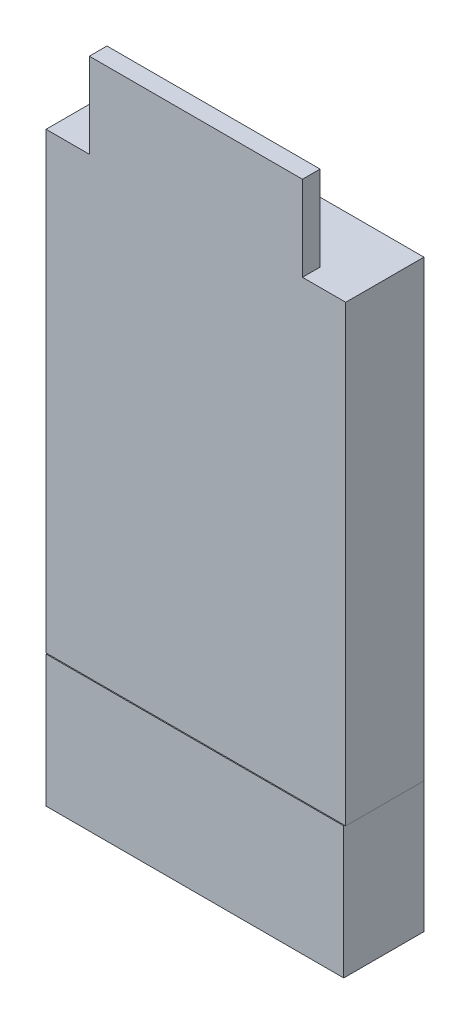
ISO-10303-21;
HEADER;
FILE_DESCRIPTION(('STEP AP214'),'2;1');
FILE_NAME('part.step','',(''),(''),'','','');
FILE_SCHEMA(('AUTOMOTIVE_DESIGN { 1 0 10303 214 1 1 1 1 }'));
ENDSEC;
DATA;
#1=APPLICATION_CONTEXT('core data for automotive mechanical design processes');
#2=APPLICATION_PROTOCOL_DEFINITION('international standard','automotive_design',2000,#1);
#3=PRODUCT_CONTEXT('',#1,'mechanical');
#4=PRODUCT('Part','Part','',(#3));
#5=PRODUCT_RELATED_PRODUCT_CATEGORY('part','',(#4));
#6=PRODUCT_DEFINITION_FORMATION('','',#4);
#7=PRODUCT_DEFINITION_CONTEXT('part definition',#1,'design');
#8=PRODUCT_DEFINITION('design','',#6,#7);
#9=PRODUCT_DEFINITION_SHAPE('','',#8);
#10=(LENGTH_UNIT() NAMED_UNIT(*) SI_UNIT(.MILLI.,.METRE.));
#11=(NAMED_UNIT(*) PLANE_ANGLE_UNIT() SI_UNIT($,.RADIAN.));
#12=(NAMED_UNIT(*) SI_UNIT($,.STERADIAN.) SOLID_ANGLE_UNIT());
#13=UNCERTAINTY_MEASURE_WITH_UNIT(LENGTH_MEASURE(1.E-05),#10,'distance_accuracy_value','');
#14=(GEOMETRIC_REPRESENTATION_CONTEXT(3) GLOBAL_UNCERTAINTY_ASSIGNED_CONTEXT((#13)) GLOBAL_UNIT_ASSIGNED_CONTEXT((#10,
#11,#12)) REPRESENTATION_CONTEXT('',''));
#15=CARTESIAN_POINT('',(0.,0.,0.));
#16=DIRECTION('',(0.,0.,1.));
#17=DIRECTION('',(1.,0.,0.));
#18=AXIS2_PLACEMENT_3D('',#15,#16,#17);
#19=CARTESIAN_POINT('',(0.,32.41,0.));
#20=DIRECTION('',(0.,-1.,0.));
#21=DIRECTION('',(0.,0.,-1.));
#22=AXIS2_PLACEMENT_3D('',#19,#20,#21);
#23=PLANE('',#22);
#24=DIRECTION('',(0.,0.,-1.));
#25=VECTOR('',#24,1.);
#26=CARTESIAN_POINT('',(6.65,32.41,4.94));
#27=LINE('',#26,#25);
#28=CARTESIAN_POINT('',(6.65,32.41,4.94));
#29=VERTEX_POINT('',#28);
#30=CARTESIAN_POINT('',(6.65,32.41,3.84));
#31=VERTEX_POINT('',#30);
#32=EDGE_CURVE('E59',#29,#31,#27,.T.);
#33=ORIENTED_EDGE('',*,*,#32,.F.);
#34=DIRECTION('',(1.,0.,0.));
#35=VECTOR('',#34,1.);
#36=CARTESIAN_POINT('',(9.35,32.41,4.94));
#37=LINE('',#36,#35);
#38=CARTESIAN_POINT('',(9.35,32.41,4.94));
#39=VERTEX_POINT('',#38);
#40=EDGE_CURVE('E172',#29,#39,#37,.T.);
#41=ORIENTED_EDGE('',*,*,#40,.T.);
#42=DIRECTION('',(0.,0.,-1.));
#43=VECTOR('',#42,1.);
#44=CARTESIAN_POINT('',(9.35,32.41,0.0600000000000006));
#45=LINE('',#44,#43);
#46=CARTESIAN_POINT('',(9.35,32.41,0.0600000000000006));
#47=VERTEX_POINT('',#46);
#48=EDGE_CURVE('E175',#39,#47,#45,.T.);
#49=ORIENTED_EDGE('',*,*,#48,.T.);
#50=DIRECTION('',(-1.,0.,0.));
#51=VECTOR('',#50,1.);
#52=CARTESIAN_POINT('',(9.35,32.41,0.0600000000000006));
#53=LINE('',#52,#51);
#54=CARTESIAN_POINT('',(-9.35,32.41,0.0600000000000049));
#55=VERTEX_POINT('',#54);
#56=EDGE_CURVE('E177',#47,#55,#53,.T.);
#57=ORIENTED_EDGE('',*,*,#56,.T.);
#58=DIRECTION('',(0.,0.,1.));
#59=VECTOR('',#58,1.);
#60=CARTESIAN_POINT('',(-9.35,32.41,0.0600000000000049));
#61=LINE('',#60,#59);
#62=CARTESIAN_POINT('',(-9.35,32.41,4.94));
#63=VERTEX_POINT('',#62);
#64=EDGE_CURVE('E169',#55,#63,#61,.T.);
#65=ORIENTED_EDGE('',*,*,#64,.T.);
#66=CARTESIAN_POINT('',(-6.65,32.41,4.94));
#67=VERTEX_POINT('',#66);
#68=EDGE_CURVE('E173',#63,#67,#37,.T.);
#69=ORIENTED_EDGE('',*,*,#68,.T.);
#70=DIRECTION('',(0.,0.,1.));
#71=VECTOR('',#70,1.);
#72=CARTESIAN_POINT('',(-6.65,32.41,4.94));
#73=LINE('',#72,#71);
#74=CARTESIAN_POINT('',(-6.65,32.41,3.84));
#75=VERTEX_POINT('',#74);
#76=EDGE_CURVE('E157',#75,#67,#73,.T.);
#77=ORIENTED_EDGE('',*,*,#76,.F.);
#78=DIRECTION('',(-1.,0.,0.));
#79=VECTOR('',#78,1.);
#80=CARTESIAN_POINT('',(6.65,32.41,3.84));
#81=LINE('',#80,#79);
#82=EDGE_CURVE('E54',#31,#75,#81,.T.);
#83=ORIENTED_EDGE('',*,*,#82,.F.);
#84=EDGE_LOOP('',(#33,#41,#49,#57,#65,#69,#77,#83));
#85=FACE_BOUND('',#84,.T.);
#86=ADVANCED_FACE('F35',(#85),#23,.F.);
#87=CARTESIAN_POINT('',(-9.285,4.11,5.));
#88=DIRECTION('',(0.,-1.,0.));
#89=DIRECTION('',(0.,0.,-1.));
#90=AXIS2_PLACEMENT_3D('',#87,#88,#89);
#91=PLANE('',#90);
#92=DIRECTION('',(-1.,0.,0.));
#93=VECTOR('',#92,1.);
#94=CARTESIAN_POINT('',(9.35,4.11,0.0600000000000006));
#95=LINE('',#94,#93);
#96=CARTESIAN_POINT('',(9.285,4.11,0.0600000000000028));
#97=VERTEX_POINT('',#96);
#98=CARTESIAN_POINT('',(-9.285,4.11,0.0600000000000028));
#99=VERTEX_POINT('',#98);
#100=EDGE_CURVE('E11',#97,#99,#95,.T.);
#101=ORIENTED_EDGE('',*,*,#100,.F.);
#102=DIRECTION('',(0.,0.,-1.));
#103=VECTOR('',#102,1.);
#104=CARTESIAN_POINT('',(9.285,4.11,5.));
#105=LINE('',#104,#103);
#106=CARTESIAN_POINT('',(9.285,4.11,0.));
#107=VERTEX_POINT('',#106);
#108=EDGE_CURVE('E224',#97,#107,#105,.T.);
#109=ORIENTED_EDGE('',*,*,#108,.T.);
#110=DIRECTION('',(-1.,0.,0.));
#111=VECTOR('',#110,1.);
#112=CARTESIAN_POINT('',(-9.285,4.11,0.));
#113=LINE('',#112,#111);
#114=CARTESIAN_POINT('',(-9.285,4.11,0.));
#115=VERTEX_POINT('',#114);
#116=EDGE_CURVE('E211',#107,#115,#113,.T.);
#117=ORIENTED_EDGE('',*,*,#116,.T.);
#118=DIRECTION('',(0.,0.,-1.));
#119=VECTOR('',#118,1.);
#120=CARTESIAN_POINT('',(-9.285,4.11,5.));
#121=LINE('',#120,#119);
#122=EDGE_CURVE('E221',#99,#115,#121,.T.);
#123=ORIENTED_EDGE('',*,*,#122,.F.);
#124=EDGE_LOOP('',(#101,#109,#117,#123));
#125=FACE_BOUND('',#124,.T.);
#126=ADVANCED_FACE('F238',(#125),#91,.F.);
#127=DIRECTION('',(1.,0.,0.));
#128=VECTOR('',#127,1.);
#129=CARTESIAN_POINT('',(9.35,4.11,4.94));
#130=LINE('',#129,#128);
#131=CARTESIAN_POINT('',(-9.285,4.11,4.94));
#132=VERTEX_POINT('',#131);
#133=CARTESIAN_POINT('',(9.285,4.11,4.94));
#134=VERTEX_POINT('',#133);
#135=EDGE_CURVE('E44',#132,#134,#130,.T.);
#136=ORIENTED_EDGE('',*,*,#135,.F.);
#137=CARTESIAN_POINT('',(-9.285,4.11,5.));
#138=VERTEX_POINT('',#137);
#139=EDGE_CURVE('E222',#138,#132,#121,.T.);
#140=ORIENTED_EDGE('',*,*,#139,.F.);
#141=DIRECTION('',(-1.,0.,0.));
#142=VECTOR('',#141,1.);
#143=CARTESIAN_POINT('',(-9.285,4.11,5.));
#144=LINE('',#143,#142);
#145=CARTESIAN_POINT('',(9.285,4.11,5.));
#146=VERTEX_POINT('',#145);
#147=EDGE_CURVE('E201',#146,#138,#144,.T.);
#148=ORIENTED_EDGE('',*,*,#147,.F.);
#149=EDGE_CURVE('E39',#146,#134,#105,.T.);
#150=ORIENTED_EDGE('',*,*,#149,.T.);
#151=EDGE_LOOP('',(#136,#140,#148,#150));
#152=FACE_BOUND('',#151,.T.);
#153=ADVANCED_FACE('F255',(#152),#91,.F.);
#154=CARTESIAN_POINT('',(9.285,-4.11,5.));
#155=DIRECTION('',(-1.,0.,0.));
#156=DIRECTION('',(0.,0.,1.));
#157=AXIS2_PLACEMENT_3D('',#154,#155,#156);
#158=PLANE('',#157);
#159=DIRECTION('',(0.,1.,0.));
#160=VECTOR('',#159,1.);
#161=CARTESIAN_POINT('',(9.285,-4.11,0.));
#162=LINE('',#161,#160);
#163=CARTESIAN_POINT('',(9.285,-4.11,0.));
#164=VERTEX_POINT('',#163);
#165=EDGE_CURVE('E197',#164,#107,#162,.T.);
#166=ORIENTED_EDGE('',*,*,#165,.T.);
#167=ORIENTED_EDGE('',*,*,#108,.F.);
#168=EDGE_CURVE('E231',#134,#97,#105,.T.);
#169=ORIENTED_EDGE('',*,*,#168,.F.);
#170=ORIENTED_EDGE('',*,*,#149,.F.);
#171=DIRECTION('',(0.,1.,0.));
#172=VECTOR('',#171,1.);
#173=CARTESIAN_POINT('',(9.285,-4.11,5.));
#174=LINE('',#173,#172);
#175=CARTESIAN_POINT('',(9.285,-4.11,5.));
#176=VERTEX_POINT('',#175);
#177=EDGE_CURVE('E198',#176,#146,#174,.T.);
#178=ORIENTED_EDGE('',*,*,#177,.F.);
#179=DIRECTION('',(0.,0.,-1.));
#180=VECTOR('',#179,1.);
#181=CARTESIAN_POINT('',(9.285,-4.11,5.));
#182=LINE('',#181,#180);
#183=EDGE_CURVE('E208',#176,#164,#182,.T.);
#184=ORIENTED_EDGE('',*,*,#183,.T.);
#185=EDGE_LOOP('',(#166,#167,#169,#170,#178,#184));
#186=FACE_BOUND('',#185,.T.);
#187=ADVANCED_FACE('F37',(#186),#158,.F.);
#188=CARTESIAN_POINT('',(-9.285,-4.11,5.));
#189=DIRECTION('',(1.,0.,0.));
#190=DIRECTION('',(0.,0.,-1.));
#191=AXIS2_PLACEMENT_3D('',#188,#189,#190);
#192=PLANE('',#191);
#193=DIRECTION('',(0.,-1.,0.));
#194=VECTOR('',#193,1.);
#195=CARTESIAN_POINT('',(-9.285,-4.11,0.));
#196=LINE('',#195,#194);
#197=CARTESIAN_POINT('',(-9.285,-4.11,0.));
#198=VERTEX_POINT('',#197);
#199=EDGE_CURVE('E214',#115,#198,#196,.T.);
#200=ORIENTED_EDGE('',*,*,#199,.T.);
#201=DIRECTION('',(0.,0.,-1.));
#202=VECTOR('',#201,1.);
#203=CARTESIAN_POINT('',(-9.285,-4.11,5.));
#204=LINE('',#203,#202);
#205=CARTESIAN_POINT('',(-9.285,-4.11,5.));
#206=VERTEX_POINT('',#205);
#207=EDGE_CURVE('E219',#206,#198,#204,.T.);
#208=ORIENTED_EDGE('',*,*,#207,.F.);
#209=DIRECTION('',(0.,-1.,0.));
#210=VECTOR('',#209,1.);
#211=CARTESIAN_POINT('',(-9.285,-4.11,5.));
#212=LINE('',#211,#210);
#213=EDGE_CURVE('E204',#138,#206,#212,.T.);
#214=ORIENTED_EDGE('',*,*,#213,.F.);
#215=ORIENTED_EDGE('',*,*,#139,.T.);
#216=EDGE_CURVE('E225',#132,#99,#121,.T.);
#217=ORIENTED_EDGE('',*,*,#216,.T.);
#218=ORIENTED_EDGE('',*,*,#122,.T.);
#219=EDGE_LOOP('',(#200,#208,#214,#215,#217,#218));
#220=FACE_BOUND('',#219,.T.);
#221=ADVANCED_FACE('F232',(#220),#192,.F.);
#222=CARTESIAN_POINT('',(-9.285,-4.11,5.));
#223=DIRECTION('',(0.,1.,0.));
#224=DIRECTION('',(0.,0.,1.));
#225=AXIS2_PLACEMENT_3D('',#222,#223,#224);
#226=PLANE('',#225);
#227=DIRECTION('',(1.,0.,0.));
#228=VECTOR('',#227,1.);
#229=CARTESIAN_POINT('',(-9.285,-4.11,0.));
#230=LINE('',#229,#228);
#231=EDGE_CURVE('E202',#198,#164,#230,.T.);
#232=ORIENTED_EDGE('',*,*,#231,.T.);
#233=ORIENTED_EDGE('',*,*,#183,.F.);
#234=DIRECTION('',(1.,0.,0.));
#235=VECTOR('',#234,1.);
#236=CARTESIAN_POINT('',(-9.285,-4.11,5.));
#237=LINE('',#236,#235);
#238=EDGE_CURVE('E206',#206,#176,#237,.T.);
#239=ORIENTED_EDGE('',*,*,#238,.F.);
#240=ORIENTED_EDGE('',*,*,#207,.T.);
#241=EDGE_LOOP('',(#232,#233,#239,#240));
#242=FACE_BOUND('',#241,.T.);
#243=ADVANCED_FACE('F246',(#242),#226,.F.);
#244=CARTESIAN_POINT('',(0.,0.,5.));
#245=DIRECTION('',(0.,0.,-1.));
#246=DIRECTION('',(-1.,0.,0.));
#247=AXIS2_PLACEMENT_3D('',#244,#245,#246);
#248=PLANE('',#247);
#249=ORIENTED_EDGE('',*,*,#177,.T.);
#250=ORIENTED_EDGE('',*,*,#147,.T.);
#251=ORIENTED_EDGE('',*,*,#213,.T.);
#252=ORIENTED_EDGE('',*,*,#238,.T.);
#253=EDGE_LOOP('',(#249,#250,#251,#252));
#254=FACE_BOUND('',#253,.T.);
#255=ADVANCED_FACE('F253',(#254),#248,.F.);
#256=CARTESIAN_POINT('',(0.,0.,0.));
#257=DIRECTION('',(0.,0.,-1.));
#258=DIRECTION('',(-1.,0.,0.));
#259=AXIS2_PLACEMENT_3D('',#256,#257,#258);
#260=PLANE('',#259);
#261=ORIENTED_EDGE('',*,*,#165,.F.);
#262=ORIENTED_EDGE('',*,*,#231,.F.);
#263=ORIENTED_EDGE('',*,*,#199,.F.);
#264=ORIENTED_EDGE('',*,*,#116,.F.);
#265=EDGE_LOOP('',(#261,#262,#263,#264));
#266=FACE_BOUND('',#265,.T.);
#267=ADVANCED_FACE('F243',(#266),#260,.T.);
#268=CARTESIAN_POINT('',(0.,4.11,0.));
#269=DIRECTION('',(0.,-1.,0.));
#270=DIRECTION('',(0.,0.,-1.));
#271=AXIS2_PLACEMENT_3D('',#268,#269,#270);
#272=PLANE('',#271);
#273=ORIENTED_EDGE('',*,*,#216,.F.);
#274=CARTESIAN_POINT('',(-9.35,4.11,4.94));
#275=VERTEX_POINT('',#274);
#276=EDGE_CURVE('E180',#275,#132,#130,.T.);
#277=ORIENTED_EDGE('',*,*,#276,.F.);
#278=DIRECTION('',(0.,0.,1.));
#279=VECTOR('',#278,1.);
#280=CARTESIAN_POINT('',(-9.35,4.11,0.0600000000000049));
#281=LINE('',#280,#279);
#282=CARTESIAN_POINT('',(-9.35,4.11,0.0600000000000049));
#283=VERTEX_POINT('',#282);
#284=EDGE_CURVE('E160',#283,#275,#281,.T.);
#285=ORIENTED_EDGE('',*,*,#284,.F.);
#286=EDGE_CURVE('E47',#99,#283,#95,.T.);
#287=ORIENTED_EDGE('',*,*,#286,.F.);
#288=EDGE_LOOP('',(#273,#277,#285,#287));
#289=FACE_BOUND('',#288,.T.);
#290=ADVANCED_FACE('F292',(#289),#272,.T.);
#291=CARTESIAN_POINT('',(-9.35,32.41,0.0600000000000049));
#292=DIRECTION('',(1.,0.,0.));
#293=DIRECTION('',(0.,0.,-1.));
#294=AXIS2_PLACEMENT_3D('',#291,#292,#293);
#295=PLANE('',#294);
#296=ORIENTED_EDGE('',*,*,#284,.T.);
#297=DIRECTION('',(0.,-1.,0.));
#298=VECTOR('',#297,1.);
#299=CARTESIAN_POINT('',(-9.35,32.41,4.94));
#300=LINE('',#299,#298);
#301=EDGE_CURVE('E194',#63,#275,#300,.T.);
#302=ORIENTED_EDGE('',*,*,#301,.F.);
#303=ORIENTED_EDGE('',*,*,#64,.F.);
#304=DIRECTION('',(0.,-1.,0.));
#305=VECTOR('',#304,1.);
#306=CARTESIAN_POINT('',(-9.35,32.41,0.0600000000000049));
#307=LINE('',#306,#305);
#308=EDGE_CURVE('E178',#55,#283,#307,.T.);
#309=ORIENTED_EDGE('',*,*,#308,.T.);
#310=EDGE_LOOP('',(#296,#302,#303,#309));
#311=FACE_BOUND('',#310,.T.);
#312=ADVANCED_FACE('F290',(#311),#295,.F.);
#313=CARTESIAN_POINT('',(9.35,32.41,4.94));
#314=DIRECTION('',(0.,0.,-1.));
#315=DIRECTION('',(-1.,0.,0.));
#316=AXIS2_PLACEMENT_3D('',#313,#314,#315);
#317=PLANE('',#316);
#318=ORIENTED_EDGE('',*,*,#276,.T.);
#319=ORIENTED_EDGE('',*,*,#135,.T.);
#320=CARTESIAN_POINT('',(9.35,4.11,4.94));
#321=VERTEX_POINT('',#320);
#322=EDGE_CURVE('E163',#134,#321,#130,.T.);
#323=ORIENTED_EDGE('',*,*,#322,.T.);
#324=DIRECTION('',(0.,-1.,0.));
#325=VECTOR('',#324,1.);
#326=CARTESIAN_POINT('',(9.35,32.41,4.94));
#327=LINE('',#326,#325);
#328=EDGE_CURVE('E191',#39,#321,#327,.T.);
#329=ORIENTED_EDGE('',*,*,#328,.F.);
#330=ORIENTED_EDGE('',*,*,#40,.F.);
#331=DIRECTION('',(0.,-1.,0.));
#332=VECTOR('',#331,1.);
#333=CARTESIAN_POINT('',(6.65,37.71,4.94));
#334=LINE('',#333,#332);
#335=CARTESIAN_POINT('',(6.65,37.71,4.94));
#336=VERTEX_POINT('',#335);
#337=EDGE_CURVE('E276',#336,#29,#334,.T.);
#338=ORIENTED_EDGE('',*,*,#337,.F.);
#339=DIRECTION('',(1.,0.,0.));
#340=VECTOR('',#339,1.);
#341=CARTESIAN_POINT('',(6.65,37.71,4.94));
#342=LINE('',#341,#340);
#343=CARTESIAN_POINT('',(-6.65,37.71,4.94));
#344=VERTEX_POINT('',#343);
#345=EDGE_CURVE('E153',#344,#336,#342,.T.);
#346=ORIENTED_EDGE('',*,*,#345,.F.);
#347=DIRECTION('',(0.,-1.,0.));
#348=VECTOR('',#347,1.);
#349=CARTESIAN_POINT('',(-6.65,37.71,4.94));
#350=LINE('',#349,#348);
#351=EDGE_CURVE('E165',#344,#67,#350,.T.);
#352=ORIENTED_EDGE('',*,*,#351,.T.);
#353=ORIENTED_EDGE('',*,*,#68,.F.);
#354=ORIENTED_EDGE('',*,*,#301,.T.);
#355=EDGE_LOOP('',(#318,#319,#323,#329,#330,#338,#346,#352,#353,#354));
#356=FACE_BOUND('',#355,.T.);
#357=ADVANCED_FACE('F260',(#356),#317,.F.);
#358=CARTESIAN_POINT('',(9.35,32.41,0.0600000000000006));
#359=DIRECTION('',(-1.,0.,0.));
#360=DIRECTION('',(0.,0.,1.));
#361=AXIS2_PLACEMENT_3D('',#358,#359,#360);
#362=PLANE('',#361);
#363=DIRECTION('',(0.,0.,-1.));
#364=VECTOR('',#363,1.);
#365=CARTESIAN_POINT('',(9.35,4.11,0.0600000000000006));
#366=LINE('',#365,#364);
#367=CARTESIAN_POINT('',(9.35,4.11,0.0600000000000006));
#368=VERTEX_POINT('',#367);
#369=EDGE_CURVE('E183',#321,#368,#366,.T.);
#370=ORIENTED_EDGE('',*,*,#369,.T.);
#371=DIRECTION('',(0.,-1.,0.));
#372=VECTOR('',#371,1.);
#373=CARTESIAN_POINT('',(9.35,32.41,0.0600000000000006));
#374=LINE('',#373,#372);
#375=EDGE_CURVE('E188',#47,#368,#374,.T.);
#376=ORIENTED_EDGE('',*,*,#375,.F.);
#377=ORIENTED_EDGE('',*,*,#48,.F.);
#378=ORIENTED_EDGE('',*,*,#328,.T.);
#379=EDGE_LOOP('',(#370,#376,#377,#378));
#380=FACE_BOUND('',#379,.T.);
#381=ADVANCED_FACE('F266',(#380),#362,.F.);
#382=CARTESIAN_POINT('',(9.35,32.41,0.0600000000000006));
#383=DIRECTION('',(0.,0.,1.));
#384=DIRECTION('',(1.,0.,0.));
#385=AXIS2_PLACEMENT_3D('',#382,#383,#384);
#386=PLANE('',#385);
#387=EDGE_CURVE('E46',#368,#97,#95,.T.);
#388=ORIENTED_EDGE('',*,*,#387,.T.);
#389=ORIENTED_EDGE('',*,*,#100,.T.);
#390=ORIENTED_EDGE('',*,*,#286,.T.);
#391=ORIENTED_EDGE('',*,*,#308,.F.);
#392=ORIENTED_EDGE('',*,*,#56,.F.);
#393=ORIENTED_EDGE('',*,*,#375,.T.);
#394=EDGE_LOOP('',(#388,#389,#390,#391,#392,#393));
#395=FACE_BOUND('',#394,.T.);
#396=ADVANCED_FACE('F271',(#395),#386,.F.);
#397=ORIENTED_EDGE('',*,*,#322,.F.);
#398=ORIENTED_EDGE('',*,*,#168,.T.);
#399=ORIENTED_EDGE('',*,*,#387,.F.);
#400=ORIENTED_EDGE('',*,*,#369,.F.);
#401=EDGE_LOOP('',(#397,#398,#399,#400));
#402=FACE_BOUND('',#401,.T.);
#403=ADVANCED_FACE('F269',(#402),#272,.T.);
#404=CARTESIAN_POINT('',(6.65,37.71,4.94));
#405=DIRECTION('',(-1.,0.,0.));
#406=DIRECTION('',(0.,0.,1.));
#407=AXIS2_PLACEMENT_3D('',#404,#405,#406);
#408=PLANE('',#407);
#409=ORIENTED_EDGE('',*,*,#32,.T.);
#410=DIRECTION('',(0.,-1.,0.));
#411=VECTOR('',#410,1.);
#412=CARTESIAN_POINT('',(6.65,37.71,3.84));
#413=LINE('',#412,#411);
#414=CARTESIAN_POINT('',(6.65,37.71,3.84));
#415=VERTEX_POINT('',#414);
#416=EDGE_CURVE('E142',#415,#31,#413,.T.);
#417=ORIENTED_EDGE('',*,*,#416,.F.);
#418=DIRECTION('',(0.,0.,-1.));
#419=VECTOR('',#418,1.);
#420=CARTESIAN_POINT('',(6.65,37.71,4.94));
#421=LINE('',#420,#419);
#422=EDGE_CURVE('E148',#336,#415,#421,.T.);
#423=ORIENTED_EDGE('',*,*,#422,.F.);
#424=ORIENTED_EDGE('',*,*,#337,.T.);
#425=EDGE_LOOP('',(#409,#417,#423,#424));
#426=FACE_BOUND('',#425,.T.);
#427=ADVANCED_FACE('F159',(#426),#408,.F.);
#428=CARTESIAN_POINT('',(6.65,37.71,3.84));
#429=DIRECTION('',(0.,0.,1.));
#430=DIRECTION('',(1.,0.,0.));
#431=AXIS2_PLACEMENT_3D('',#428,#429,#430);
#432=PLANE('',#431);
#433=ORIENTED_EDGE('',*,*,#82,.T.);
#434=DIRECTION('',(0.,-1.,0.));
#435=VECTOR('',#434,1.);
#436=CARTESIAN_POINT('',(-6.65,37.71,3.84));
#437=LINE('',#436,#435);
#438=CARTESIAN_POINT('',(-6.65,37.71,3.84));
#439=VERTEX_POINT('',#438);
#440=EDGE_CURVE('E144',#439,#75,#437,.T.);
#441=ORIENTED_EDGE('',*,*,#440,.F.);
#442=DIRECTION('',(-1.,0.,0.));
#443=VECTOR('',#442,1.);
#444=CARTESIAN_POINT('',(6.65,37.71,3.84));
#445=LINE('',#444,#443);
#446=EDGE_CURVE('E138',#415,#439,#445,.T.);
#447=ORIENTED_EDGE('',*,*,#446,.F.);
#448=ORIENTED_EDGE('',*,*,#416,.T.);
#449=EDGE_LOOP('',(#433,#441,#447,#448));
#450=FACE_BOUND('',#449,.T.);
#451=ADVANCED_FACE('F140',(#450),#432,.F.);
#452=CARTESIAN_POINT('',(-6.65,37.71,4.94));
#453=DIRECTION('',(1.,0.,0.));
#454=DIRECTION('',(0.,0.,-1.));
#455=AXIS2_PLACEMENT_3D('',#452,#453,#454);
#456=PLANE('',#455);
#457=ORIENTED_EDGE('',*,*,#76,.T.);
#458=ORIENTED_EDGE('',*,*,#351,.F.);
#459=DIRECTION('',(0.,0.,1.));
#460=VECTOR('',#459,1.);
#461=CARTESIAN_POINT('',(-6.65,37.71,4.94));
#462=LINE('',#461,#460);
#463=EDGE_CURVE('E147',#439,#344,#462,.T.);
#464=ORIENTED_EDGE('',*,*,#463,.F.);
#465=ORIENTED_EDGE('',*,*,#440,.T.);
#466=EDGE_LOOP('',(#457,#458,#464,#465));
#467=FACE_BOUND('',#466,.T.);
#468=ADVANCED_FACE('F287',(#467),#456,.F.);
#469=CARTESIAN_POINT('',(0.,37.71,0.));
#470=DIRECTION('',(0.,1.,0.));
#471=DIRECTION('',(0.,0.,1.));
#472=AXIS2_PLACEMENT_3D('',#469,#470,#471);
#473=PLANE('',#472);
#474=ORIENTED_EDGE('',*,*,#422,.T.);
#475=ORIENTED_EDGE('',*,*,#446,.T.);
#476=ORIENTED_EDGE('',*,*,#463,.T.);
#477=ORIENTED_EDGE('',*,*,#345,.T.);
#478=EDGE_LOOP('',(#474,#475,#476,#477));
#479=FACE_BOUND('',#478,.T.);
#480=ADVANCED_FACE('F151',(#479),#473,.T.);
#481=CLOSED_SHELL('',(#86,#126,#153,#187,#221,#243,#255,#267,#290,#312,#357,#381,#396,#403,#427,
#451,#468,#480));
#482=MANIFOLD_SOLID_BREP('B2',#481);
#483=ADVANCED_BREP_SHAPE_REPRESENTATION('',(#18,#482),#14);
#484=SHAPE_DEFINITION_REPRESENTATION(#9,#483);
ENDSEC;
END-ISO-10303-21;
